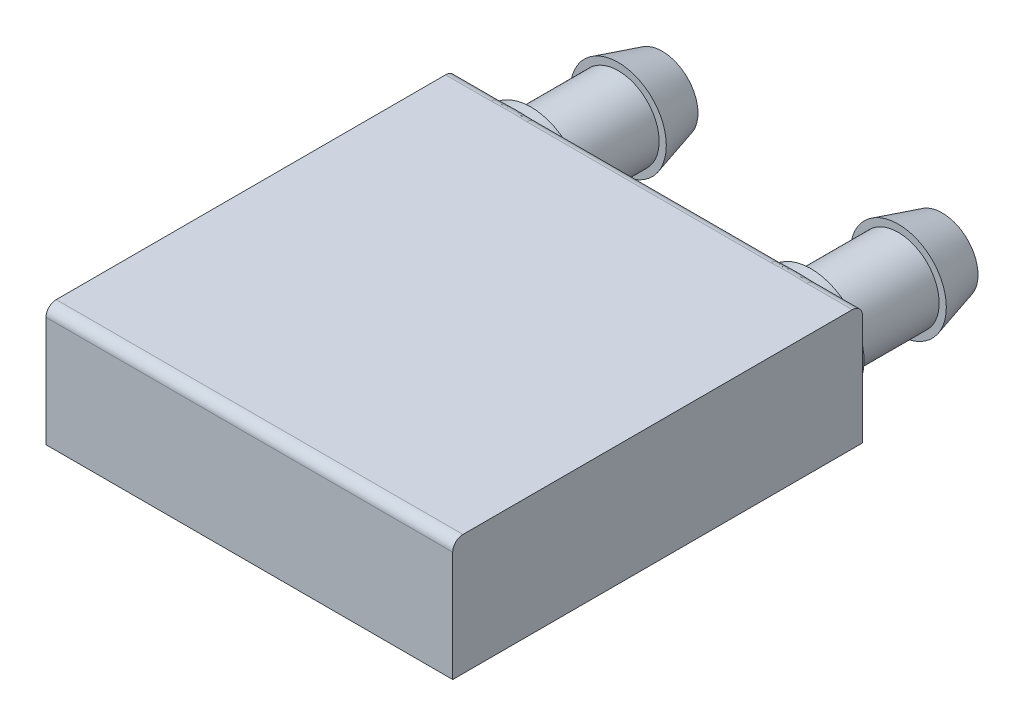
ISO-10303-21;
HEADER;
FILE_DESCRIPTION(('STEP AP214'),'2;1');
FILE_NAME('part.step','',(''),(''),'','','');
FILE_SCHEMA(('AUTOMOTIVE_DESIGN { 1 0 10303 214 1 1 1 1 }'));
ENDSEC;
DATA;
#1=APPLICATION_CONTEXT('core data for automotive mechanical design processes');
#2=APPLICATION_PROTOCOL_DEFINITION('international standard','automotive_design',2000,#1);
#3=PRODUCT_CONTEXT('',#1,'mechanical');
#4=PRODUCT('Part','Part','',(#3));
#5=PRODUCT_RELATED_PRODUCT_CATEGORY('part','',(#4));
#6=PRODUCT_DEFINITION_FORMATION('','',#4);
#7=PRODUCT_DEFINITION_CONTEXT('part definition',#1,'design');
#8=PRODUCT_DEFINITION('design','',#6,#7);
#9=PRODUCT_DEFINITION_SHAPE('','',#8);
#10=(LENGTH_UNIT() NAMED_UNIT(*) SI_UNIT(.MILLI.,.METRE.));
#11=(NAMED_UNIT(*) PLANE_ANGLE_UNIT() SI_UNIT($,.RADIAN.));
#12=(NAMED_UNIT(*) SI_UNIT($,.STERADIAN.) SOLID_ANGLE_UNIT());
#13=UNCERTAINTY_MEASURE_WITH_UNIT(LENGTH_MEASURE(1.E-05),#10,'distance_accuracy_value','');
#14=(GEOMETRIC_REPRESENTATION_CONTEXT(3) GLOBAL_UNCERTAINTY_ASSIGNED_CONTEXT((#13)) GLOBAL_UNIT_ASSIGNED_CONTEXT((#10,
#11,#12)) REPRESENTATION_CONTEXT('',''));
#15=CARTESIAN_POINT('',(0.,0.,0.));
#16=DIRECTION('',(0.,0.,1.));
#17=DIRECTION('',(1.,0.,0.));
#18=AXIS2_PLACEMENT_3D('',#15,#16,#17);
#19=CARTESIAN_POINT('',(0.,11.8,0.));
#20=DIRECTION('',(1.,0.,0.));
#21=DIRECTION('',(0.,0.,-1.));
#22=AXIS2_PLACEMENT_3D('',#19,#20,#21);
#23=PLANE('',#22);
#24=DIRECTION('',(0.,-1.,0.));
#25=VECTOR('',#24,1.);
#26=CARTESIAN_POINT('',(0.,11.8,0.));
#27=LINE('',#26,#25);
#28=CARTESIAN_POINT('',(0.,10.8,0.));
#29=VERTEX_POINT('',#28);
#30=CARTESIAN_POINT('',(0.,0.,0.));
#31=VERTEX_POINT('',#30);
#32=EDGE_CURVE('E117',#29,#31,#27,.T.);
#33=ORIENTED_EDGE('',*,*,#32,.F.);
#34=CARTESIAN_POINT('',(0.,10.8,-1.));
#35=DIRECTION('',(1.,0.,0.));
#36=DIRECTION('',(0.,0.,-1.));
#37=AXIS2_PLACEMENT_3D('',#34,#35,#36);
#38=CIRCLE('',#37,1.);
#39=CARTESIAN_POINT('',(0.,11.8,-1.));
#40=VERTEX_POINT('',#39);
#41=EDGE_CURVE('E397',#29,#40,#38,.F.);
#42=ORIENTED_EDGE('',*,*,#41,.T.);
#43=DIRECTION('',(0.,0.,1.));
#44=VECTOR('',#43,1.);
#45=CARTESIAN_POINT('',(0.,11.8,0.));
#46=LINE('',#45,#44);
#47=CARTESIAN_POINT('',(0.,11.8,-39.1));
#48=VERTEX_POINT('',#47);
#49=EDGE_CURVE('E152',#48,#40,#46,.T.);
#50=ORIENTED_EDGE('',*,*,#49,.F.);
#51=CARTESIAN_POINT('',(0.,10.8,-39.1));
#52=DIRECTION('',(1.,0.,0.));
#53=DIRECTION('',(0.,0.,-1.));
#54=AXIS2_PLACEMENT_3D('',#51,#52,#53);
#55=CIRCLE('',#54,1.);
#56=CARTESIAN_POINT('',(0.,10.8,-40.1));
#57=VERTEX_POINT('',#56);
#58=EDGE_CURVE('E395',#48,#57,#55,.F.);
#59=ORIENTED_EDGE('',*,*,#58,.T.);
#60=DIRECTION('',(0.,-1.,0.));
#61=VECTOR('',#60,1.);
#62=CARTESIAN_POINT('',(0.,11.8,-40.1));
#63=LINE('',#62,#61);
#64=CARTESIAN_POINT('',(0.,0.,-40.1));
#65=VERTEX_POINT('',#64);
#66=EDGE_CURVE('E138',#57,#65,#63,.T.);
#67=ORIENTED_EDGE('',*,*,#66,.T.);
#68=DIRECTION('',(0.,0.,1.));
#69=VECTOR('',#68,1.);
#70=CARTESIAN_POINT('',(0.,0.,0.));
#71=LINE('',#70,#69);
#72=EDGE_CURVE('E134',#65,#31,#71,.T.);
#73=ORIENTED_EDGE('',*,*,#72,.T.);
#74=EDGE_LOOP('',(#33,#42,#50,#59,#67,#73));
#75=FACE_BOUND('',#74,.T.);
#76=ADVANCED_FACE('F36',(#75),#23,.F.);
#77=CARTESIAN_POINT('',(0.,11.8,0.));
#78=DIRECTION('',(0.,0.,-1.));
#79=DIRECTION('',(-1.,0.,0.));
#80=AXIS2_PLACEMENT_3D('',#77,#78,#79);
#81=PLANE('',#80);
#82=DIRECTION('',(0.,-1.,0.));
#83=VECTOR('',#82,1.);
#84=CARTESIAN_POINT('',(39.8,11.8,0.));
#85=LINE('',#84,#83);
#86=CARTESIAN_POINT('',(39.8,10.8,0.));
#87=VERTEX_POINT('',#86);
#88=CARTESIAN_POINT('',(39.8,0.,0.));
#89=VERTEX_POINT('',#88);
#90=EDGE_CURVE('E128',#87,#89,#85,.T.);
#91=ORIENTED_EDGE('',*,*,#90,.F.);
#92=DIRECTION('',(1.,0.,0.));
#93=VECTOR('',#92,1.);
#94=CARTESIAN_POINT('',(0.,10.8,0.));
#95=LINE('',#94,#93);
#96=EDGE_CURVE('E124',#87,#29,#95,.F.);
#97=ORIENTED_EDGE('',*,*,#96,.T.);
#98=ORIENTED_EDGE('',*,*,#32,.T.);
#99=DIRECTION('',(1.,0.,0.));
#100=VECTOR('',#99,1.);
#101=CARTESIAN_POINT('',(0.,0.,0.));
#102=LINE('',#101,#100);
#103=EDGE_CURVE('E121',#31,#89,#102,.T.);
#104=ORIENTED_EDGE('',*,*,#103,.T.);
#105=EDGE_LOOP('',(#91,#97,#98,#104));
#106=FACE_BOUND('',#105,.T.);
#107=ADVANCED_FACE('F120',(#106),#81,.F.);
#108=CARTESIAN_POINT('',(39.8,11.8,0.));
#109=DIRECTION('',(-1.,0.,0.));
#110=DIRECTION('',(0.,0.,1.));
#111=AXIS2_PLACEMENT_3D('',#108,#109,#110);
#112=PLANE('',#111);
#113=DIRECTION('',(0.,0.,-1.));
#114=VECTOR('',#113,1.);
#115=CARTESIAN_POINT('',(39.8,11.8,0.));
#116=LINE('',#115,#114);
#117=CARTESIAN_POINT('',(39.8,11.8,-1.));
#118=VERTEX_POINT('',#117);
#119=CARTESIAN_POINT('',(39.8,11.8,-39.1));
#120=VERTEX_POINT('',#119);
#121=EDGE_CURVE('E146',#118,#120,#116,.T.);
#122=ORIENTED_EDGE('',*,*,#121,.F.);
#123=CARTESIAN_POINT('',(39.8,10.8,-1.));
#124=DIRECTION('',(-1.,0.,0.));
#125=DIRECTION('',(0.,0.,1.));
#126=AXIS2_PLACEMENT_3D('',#123,#124,#125);
#127=CIRCLE('',#126,1.);
#128=EDGE_CURVE('E263',#118,#87,#127,.F.);
#129=ORIENTED_EDGE('',*,*,#128,.T.);
#130=ORIENTED_EDGE('',*,*,#90,.T.);
#131=DIRECTION('',(0.,0.,-1.));
#132=VECTOR('',#131,1.);
#133=CARTESIAN_POINT('',(39.8,0.,0.));
#134=LINE('',#133,#132);
#135=CARTESIAN_POINT('',(39.8,0.,-40.1));
#136=VERTEX_POINT('',#135);
#137=EDGE_CURVE('E136',#89,#136,#134,.T.);
#138=ORIENTED_EDGE('',*,*,#137,.T.);
#139=DIRECTION('',(0.,-1.,0.));
#140=VECTOR('',#139,1.);
#141=CARTESIAN_POINT('',(39.8,11.8,-40.1));
#142=LINE('',#141,#140);
#143=CARTESIAN_POINT('',(39.8,10.8,-40.1));
#144=VERTEX_POINT('',#143);
#145=EDGE_CURVE('E154',#144,#136,#142,.T.);
#146=ORIENTED_EDGE('',*,*,#145,.F.);
#147=CARTESIAN_POINT('',(39.8,10.8,-39.1));
#148=DIRECTION('',(-1.,0.,0.));
#149=DIRECTION('',(0.,0.,1.));
#150=AXIS2_PLACEMENT_3D('',#147,#148,#149);
#151=CIRCLE('',#150,1.);
#152=EDGE_CURVE('E266',#144,#120,#151,.F.);
#153=ORIENTED_EDGE('',*,*,#152,.T.);
#154=EDGE_LOOP('',(#122,#129,#130,#138,#146,#153));
#155=FACE_BOUND('',#154,.T.);
#156=ADVANCED_FACE('F253',(#155),#112,.F.);
#157=CARTESIAN_POINT('',(0.,11.8,-40.1));
#158=DIRECTION('',(0.,0.,1.));
#159=DIRECTION('',(1.,0.,0.));
#160=AXIS2_PLACEMENT_3D('',#157,#158,#159);
#161=PLANE('',#160);
#162=ORIENTED_EDGE('',*,*,#66,.F.);
#163=DIRECTION('',(-1.,0.,0.));
#164=VECTOR('',#163,1.);
#165=CARTESIAN_POINT('',(0.,10.8,-40.1));
#166=LINE('',#165,#164);
#167=CARTESIAN_POINT('',(4.45931048144708,10.8,-40.1));
#168=VERTEX_POINT('',#167);
#169=EDGE_CURVE('E11',#57,#168,#166,.F.);
#170=ORIENTED_EDGE('',*,*,#169,.T.);
#171=CARTESIAN_POINT('',(6.2,5.9,-40.1));
#172=DIRECTION('',(0.,0.,1.));
#173=DIRECTION('',(1.,0.,0.));
#174=AXIS2_PLACEMENT_3D('',#171,#172,#173);
#175=CIRCLE('',#174,5.2);
#176=CARTESIAN_POINT('',(7.94068951855292,10.8,-40.1));
#177=VERTEX_POINT('',#176);
#178=EDGE_CURVE('E57',#177,#168,#175,.F.);
#179=ORIENTED_EDGE('',*,*,#178,.F.);
#180=DIRECTION('',(-1.,0.,0.));
#181=VECTOR('',#180,1.);
#182=CARTESIAN_POINT('',(0.,10.8,-40.1));
#183=LINE('',#182,#181);
#184=CARTESIAN_POINT('',(31.8593104814471,10.8,-40.1));
#185=VERTEX_POINT('',#184);
#186=EDGE_CURVE('E50',#177,#185,#183,.F.);
#187=ORIENTED_EDGE('',*,*,#186,.T.);
#188=CARTESIAN_POINT('',(33.6,5.9,-40.1));
#189=DIRECTION('',(0.,0.,1.));
#190=DIRECTION('',(1.,0.,0.));
#191=AXIS2_PLACEMENT_3D('',#188,#189,#190);
#192=CIRCLE('',#191,5.2);
#193=CARTESIAN_POINT('',(35.3406895185529,10.8,-40.1));
#194=VERTEX_POINT('',#193);
#195=EDGE_CURVE('E159',#194,#185,#192,.F.);
#196=ORIENTED_EDGE('',*,*,#195,.F.);
#197=DIRECTION('',(-1.,0.,0.));
#198=VECTOR('',#197,1.);
#199=CARTESIAN_POINT('',(0.,10.8,-40.1));
#200=LINE('',#199,#198);
#201=EDGE_CURVE('E385',#194,#144,#200,.F.);
#202=ORIENTED_EDGE('',*,*,#201,.T.);
#203=ORIENTED_EDGE('',*,*,#145,.T.);
#204=DIRECTION('',(-1.,0.,0.));
#205=VECTOR('',#204,1.);
#206=CARTESIAN_POINT('',(0.,0.,-40.1));
#207=LINE('',#206,#205);
#208=EDGE_CURVE('E150',#136,#65,#207,.T.);
#209=ORIENTED_EDGE('',*,*,#208,.T.);
#210=EDGE_LOOP('',(#162,#170,#179,#187,#196,#202,#203,#209));
#211=FACE_BOUND('',#210,.T.);
#212=ADVANCED_FACE('F200',(#211),#161,.F.);
#213=CARTESIAN_POINT('',(0.,11.8,0.));
#214=DIRECTION('',(0.,-1.,0.));
#215=DIRECTION('',(0.,0.,-1.));
#216=AXIS2_PLACEMENT_3D('',#213,#214,#215);
#217=PLANE('',#216);
#218=ORIENTED_EDGE('',*,*,#49,.T.);
#219=DIRECTION('',(1.,0.,0.));
#220=VECTOR('',#219,1.);
#221=CARTESIAN_POINT('',(0.,11.8,-1.));
#222=LINE('',#221,#220);
#223=EDGE_CURVE('E388',#40,#118,#222,.T.);
#224=ORIENTED_EDGE('',*,*,#223,.T.);
#225=ORIENTED_EDGE('',*,*,#121,.T.);
#226=DIRECTION('',(-1.,0.,0.));
#227=VECTOR('',#226,1.);
#228=CARTESIAN_POINT('',(0.,11.8,-39.1));
#229=LINE('',#228,#227);
#230=CARTESIAN_POINT('',(35.3406895185529,11.8,-39.1));
#231=VERTEX_POINT('',#230);
#232=EDGE_CURVE('E387',#120,#231,#229,.T.);
#233=ORIENTED_EDGE('',*,*,#232,.T.);
#234=CARTESIAN_POINT('',(36.2059590471005,10.3998863813251,-40.1));
#235=CARTESIAN_POINT('',(36.0514109053202,11.8,-40.6914062854075));
#236=CARTESIAN_POINT('',(36.4376715437162,11.8,-39.2133104201227));
#237=CARTESIAN_POINT('',(36.1642060523448,10.4240692555008,-40.1));
#238=CARTESIAN_POINT('',(36.0381126387893,11.8,-40.643262855771));
#239=CARTESIAN_POINT('',(36.3769460344585,11.8,-39.1974631160973));
#240=CARTESIAN_POINT('',(36.1210697849913,10.4482708656346,-40.1));
#241=CARTESIAN_POINT('',(36.0172464388454,11.8,-40.5966849735014));
#242=CARTESIAN_POINT('',(36.3157021977009,11.8,-39.1838071876804));
#243=CARTESIAN_POINT('',(36.0322298425646,10.4963900256952,-40.1));
#244=CARTESIAN_POINT('',(35.9640056764479,11.8,-40.509396550161));
#245=CARTESIAN_POINT('',(36.1925685955645,11.8,-39.1602493571056));
#246=CARTESIAN_POINT('',(35.9865294262411,10.5203078913845,-40.1));
#247=CARTESIAN_POINT('',(35.9319855313383,11.8,-40.4683833963861));
#248=CARTESIAN_POINT('',(36.1306797279427,11.8,-39.1503428086598));
#249=CARTESIAN_POINT('',(35.8461812900325,10.591012558989,-40.1));
#250=CARTESIAN_POINT('',(35.8253538891049,11.8,-40.3563215478172));
#251=CARTESIAN_POINT('',(35.9450130966358,11.8,-39.1253391762767));
#252=CARTESIAN_POINT('',(35.7478729462154,10.6369940358075,-40.1));
#253=CARTESIAN_POINT('',(35.7376385958731,11.8,-40.2907331487825));
#254=CARTESIAN_POINT('',(35.8206316990899,11.8,-39.1148150330412));
#255=CARTESIAN_POINT('',(35.5429722003345,10.7246473615643,-40.1));
#256=CARTESIAN_POINT('',(35.5442199881479,11.8,-40.1803396016544));
#257=CARTESIAN_POINT('',(35.5721926045747,11.8,-39.1020597674157));
#258=CARTESIAN_POINT('',(35.4364247568824,10.7663400568421,-40.1));
#259=CARTESIAN_POINT('',(35.438741025402,11.8,-40.1340441665053));
#260=CARTESIAN_POINT('',(35.4481365074836,11.8,-39.0997864895949));
#261=CARTESIAN_POINT('',(35.2152897020463,10.8441475617902,-40.1));
#262=CARTESIAN_POINT('',(35.2172403242021,11.8,-40.057013655889));
#263=CARTESIAN_POINT('',(35.1998879943171,11.8,-39.1002444128891));
#264=CARTESIAN_POINT('',(35.1006909366875,10.8802544022891,-40.1));
#265=CARTESIAN_POINT('',(35.1007482628657,11.8,-40.0254225232962));
#266=CARTESIAN_POINT('',(35.0756956334742,11.8,-39.1029826937221));
#267=CARTESIAN_POINT('',(34.8468065814125,10.9502787004041,-40.1));
#268=CARTESIAN_POINT('',(34.8442738684641,11.8,-39.9702131403183));
#269=CARTESIAN_POINT('',(34.8086467176646,11.8,-39.1113455617933));
#270=CARTESIAN_POINT('',(34.7064068986992,10.9830414301867,-40.1));
#271=CARTESIAN_POINT('',(34.7017278137248,11.8,-39.9476384193187));
#272=CARTESIAN_POINT('',(34.6658048157509,11.8,-39.117343680815));
#273=CARTESIAN_POINT('',(34.4187388570437,11.0372234313041,-40.1));
#274=CARTESIAN_POINT('',(34.4129045813957,11.8,-39.9134878291294));
#275=CARTESIAN_POINT('',(34.3801775211719,11.8,-39.1289136041271));
#276=CARTESIAN_POINT('',(34.2714742281667,11.0586487863993,-40.1));
#277=CARTESIAN_POINT('',(34.2652889772802,11.8,-39.9014966991213));
#278=CARTESIAN_POINT('',(34.2373921393676,11.8,-39.1344856356847));
#279=CARTESIAN_POINT('',(33.9728087517789,11.0887892077042,-40.1));
#280=CARTESIAN_POINT('',(33.9688748898342,11.8,-39.8853881779618));
#281=CARTESIAN_POINT('',(33.9516423633497,11.8,-39.1426885125737));
#282=CARTESIAN_POINT('',(33.8214055905964,11.0974970096581,-40.1));
#283=CARTESIAN_POINT('',(33.8185943817021,11.8,-39.8811016243287));
#284=CARTESIAN_POINT('',(33.8086779134743,11.8,-39.1453176767416));
#285=CARTESIAN_POINT('',(33.5180136011448,11.1015684432358,-40.1));
#286=CARTESIAN_POINT('',(33.519207924178,11.8,-39.8790842405912));
#287=CARTESIAN_POINT('',(33.5227096697332,11.8,-39.1465271735554));
#288=CARTESIAN_POINT('',(33.366024703579,11.0969304443387,-40.1));
#289=CARTESIAN_POINT('',(33.3685659606177,11.8,-39.8813335991971));
#290=CARTESIAN_POINT('',(33.3797058731946,11.8,-39.1451070114759));
#291=CARTESIAN_POINT('',(33.017327656511,11.0710654484401,-40.1));
#292=CARTESIAN_POINT('',(33.0229158871134,11.8,-39.8946918658663));
#293=CARTESIAN_POINT('',(33.0483990297321,11.8,-39.1377579045133));
#294=CARTESIAN_POINT('',(32.8217452995204,11.0450382663129,-40.1));
#295=CARTESIAN_POINT('',(32.8265939731261,11.8,-39.9086192322347));
#296=CARTESIAN_POINT('',(32.8601315408975,11.8,-39.1305403926206));
#297=CARTESIAN_POINT('',(32.4428328247797,10.9732855743908,-40.1));
#298=CARTESIAN_POINT('',(32.446044170586,11.8,-39.9540226263979));
#299=CARTESIAN_POINT('',(32.4836800417843,11.8,-39.1153032072669));
#300=CARTESIAN_POINT('',(32.259499230018,10.9275656823724,-40.1));
#301=CARTESIAN_POINT('',(32.2587343840027,11.8,-39.9864439667343));
#302=CARTESIAN_POINT('',(32.2954960230085,11.8,-39.1072837630752));
#303=CARTESIAN_POINT('',(31.9978414581151,10.8478629392358,-40.1));
#304=CARTESIAN_POINT('',(31.9973468152238,11.8,-40.054017069443));
#305=CARTESIAN_POINT('',(32.0138442298186,11.8,-39.1009052409067));
#306=CARTESIAN_POINT('',(31.9131792217457,10.8195855292717,-40.1));
#307=CARTESIAN_POINT('',(31.9117733639662,11.8,-40.0803585410739));
#308=CARTESIAN_POINT('',(31.9204614781234,11.8,-39.0997140696696));
#309=CARTESIAN_POINT('',(31.7484279791752,10.7599735819643,-40.1));
#310=CARTESIAN_POINT('',(31.7474358486076,11.8,-40.1412083903224));
#311=CARTESIAN_POINT('',(31.7337498998095,11.8,-39.1004040660646));
#312=CARTESIAN_POINT('',(31.6683365179222,10.7286407107396,-40.1));
#313=CARTESIAN_POINT('',(31.6684985952818,11.8,-40.1761069638797));
#314=CARTESIAN_POINT('',(31.640421071409,11.8,-39.1022835679949));
#315=CARTESIAN_POINT('',(31.5127128083606,10.6634412084335,-40.1));
#316=CARTESIAN_POINT('',(31.5199557858521,11.8,-40.2559067723442));
#317=CARTESIAN_POINT('',(31.4535134250338,11.8,-39.1104617477959));
#318=CARTESIAN_POINT('',(31.4372017570069,10.6295642134737,-40.1));
#319=CARTESIAN_POINT('',(31.4504114050832,11.8,-40.3014127733855));
#320=CARTESIAN_POINT('',(31.3599352695281,11.8,-39.1167794868437));
#321=CARTESIAN_POINT('',(31.2913540802878,10.5601209394779,-40.1));
#322=CARTESIAN_POINT('',(31.325857421665,11.8,-40.4035353078189));
#323=CARTESIAN_POINT('',(31.17322533657,11.8,-39.1355392468181));
#324=CARTESIAN_POINT('',(31.2210280655949,10.5245514287968,-40.1));
#325=CARTESIAN_POINT('',(31.2712349902899,11.8,-40.4609379374578));
#326=CARTESIAN_POINT('',(31.080094820163,11.8,-39.1479934462363));
#327=CARTESIAN_POINT('',(31.1535648380049,10.4885678591641,-40.1));
#328=CARTESIAN_POINT('',(31.22866427251,11.8,-40.5231845779229));
#329=CARTESIAN_POINT('',(30.9875220631558,11.8,-39.1643505899244));
#330=(BOUNDED_SURFACE() B_SPLINE_SURFACE(3,2,((#234,#235,#236),(#237,#238,#239),(#240,#241,
#242),(#243,#244,#245),(#246,#247,#248),(#249,#250,#251),(#252,#253,#254),(#255,#256,#257),
(#258,#259,#260),(#261,#262,#263),(#264,#265,#266),(#267,#268,#269),(#270,#271,#272),(#273,#274,
#275),(#276,#277,#278),(#279,#280,#281),(#282,#283,#284),(#285,#286,#287),(#288,#289,#290),
(#291,#292,#293),(#294,#295,#296),(#297,#298,#299),(#300,#301,#302),(#303,#304,#305),(#306,#307,
#308),(#309,#310,#311),(#312,#313,#314),(#315,#316,#317),(#318,#319,#320),(#321,#322,#323),
(#324,#325,#326),(#327,#328,#329)),.UNSPECIFIED.,.F.,.F.,.F.) B_SPLINE_SURFACE_WITH_KNOTS((4,2,
2,2,2,2,2,2,2,2,2,2,2,2,2,4),(3,3),(0.,0.188160562337904,0.376087183816642,0.750089334170194,
1.12217791638126,1.49479254567852,1.92369642323125,2.35236991223194,2.78128816353902,
3.21025882008098,3.77545021918975,4.34048049175736,4.62061503468712,4.90059766769383,
5.18179016989224,5.46354299157041),(0.,1.),
.UNSPECIFIED.) GEOMETRIC_REPRESENTATION_ITEM() RATIONAL_B_SPLINE_SURFACE(((1.,0.547670695457186,
1.),(1.,0.55870942729237,1.),(1.,0.569423565921806,1.),(1.,0.590171575439976,1.),(1.,
0.600206275546622,1.),(1.,0.629189184863191,1.),(1.,0.647125115902453,1.),(1.,0.680143283484577,
1.),(1.,0.695239651319312,1.),(1.,0.722676995885094,1.),(1.,0.735014046957487,1.),(1.,
0.758483860579576,1.),(1.,0.769153155051393,1.),(1.,0.786566890947717,1.),(1.,0.793313437554485,
1.),(1.,0.802756108122454,1.),(1.,0.805449917189763,1.),(1.,0.806711815618423,1.),(1.,
0.8052794008591,1.),(1.,0.797218225270102,1.),(1.,0.789083795491052,1.),(1.,0.766012291983896,
1.),(1.,0.751077158236021,1.),(1.,0.723885981241762,1.),(1.,0.714076078628515,1.),(1.,
0.692891977464697,1.),(1.,0.681518630077224,1.),(1.,0.657168011607321,1.),(1.,0.644184021977412,
1.),(1.,0.61664314601021,1.),(1.,0.602083176988512,1.),(1.,0.586757129979744,1.))) REPRESENTATION_ITEM('') SURFACE());
#331=CARTESIAN_POINT('',(36.4376715437162,11.8,-39.2133104201227));
#332=CARTESIAN_POINT('',(36.3769460344585,11.8,-39.1974631160973));
#333=CARTESIAN_POINT('',(36.3157021977009,11.8,-39.1838071876804));
#334=CARTESIAN_POINT('',(36.1925685955645,11.8,-39.1602493571056));
#335=CARTESIAN_POINT('',(36.1306797279427,11.8,-39.1503428086598));
#336=CARTESIAN_POINT('',(35.9450130966358,11.8,-39.1253391762767));
#337=CARTESIAN_POINT('',(35.8206316990898,11.8,-39.1148150330412));
#338=CARTESIAN_POINT('',(35.5721926045747,11.8,-39.1020597674157));
#339=CARTESIAN_POINT('',(35.4481365074836,11.8,-39.0997864895949));
#340=CARTESIAN_POINT('',(35.1998879943171,11.8,-39.1002444128891));
#341=CARTESIAN_POINT('',(35.0756956334742,11.8,-39.1029826937221));
#342=CARTESIAN_POINT('',(34.8086467176646,11.8,-39.1113455617933));
#343=CARTESIAN_POINT('',(34.6658048157509,11.8,-39.117343680815));
#344=CARTESIAN_POINT('',(34.3801775211719,11.8,-39.1289136041271));
#345=CARTESIAN_POINT('',(34.2373921393676,11.8,-39.1344856356847));
#346=CARTESIAN_POINT('',(33.9516423633497,11.8,-39.1426885125737));
#347=CARTESIAN_POINT('',(33.8086779134743,11.8,-39.1453176767416));
#348=CARTESIAN_POINT('',(33.5227096697332,11.8,-39.1465271735554));
#349=CARTESIAN_POINT('',(33.3797058731946,11.8,-39.1451070114758));
#350=CARTESIAN_POINT('',(33.0483990297321,11.8,-39.1377579045133));
#351=CARTESIAN_POINT('',(32.8601315408975,11.8,-39.1305403926206));
#352=CARTESIAN_POINT('',(32.4836800417843,11.8,-39.1153032072669));
#353=CARTESIAN_POINT('',(32.2954960230085,11.8,-39.1072837630752));
#354=CARTESIAN_POINT('',(32.0138442298186,11.8,-39.1009052409067));
#355=CARTESIAN_POINT('',(31.9204614781234,11.8,-39.0997140696695));
#356=CARTESIAN_POINT('',(31.7337498998095,11.8,-39.1004040660646));
#357=CARTESIAN_POINT('',(31.640421071409,11.8,-39.1022835679949));
#358=CARTESIAN_POINT('',(31.4535134250338,11.8,-39.1104617477959));
#359=CARTESIAN_POINT('',(31.3599352695281,11.8,-39.1167794868437));
#360=CARTESIAN_POINT('',(31.17322533657,11.8,-39.1355392468181));
#361=CARTESIAN_POINT('',(31.080094820163,11.8,-39.1479934462363));
#362=CARTESIAN_POINT('',(30.9875220631558,11.8,-39.1643505899244));
#363=B_SPLINE_CURVE_WITH_KNOTS('',3,(#331,#332,#333,#334,#335,#336,#337,#338,#339,#340,#341,
#342,#343,#344,#345,#346,#347,#348,#349,#350,#351,#352,#353,#354,#355,#356,#357,#358,#359,#360,
#361,#362),.UNSPECIFIED.,.F.,.F.,(4,2,2,2,2,2,2,2,2,2,2,2,2,2,2,4),(0.,0.188160562337904,
0.376087183816642,0.750089334170194,1.12217791638126,1.49479254567852,1.92369642323125,
2.35236991223194,2.78128816353902,3.21025882008098,3.77545021918975,4.34048049175736,
4.62061503468712,4.90059766769383,5.18179016989224,5.46354299157041),.UNSPECIFIED.);
#364=CARTESIAN_POINT('',(31.8593104814471,11.8,-39.1));
#365=VERTEX_POINT('',#364);
#366=EDGE_CURVE('E406',#231,#365,#363,.T.);
#367=ORIENTED_EDGE('',*,*,#366,.T.);
#368=DIRECTION('',(-1.,0.,0.));
#369=VECTOR('',#368,1.);
#370=CARTESIAN_POINT('',(0.,11.8,-39.1));
#371=LINE('',#370,#369);
#372=CARTESIAN_POINT('',(7.94068951855292,11.8,-39.1));
#373=VERTEX_POINT('',#372);
#374=EDGE_CURVE('E175',#365,#373,#371,.T.);
#375=ORIENTED_EDGE('',*,*,#374,.T.);
#376=CARTESIAN_POINT('',(8.80595906966206,10.3998863682593,-40.1));
#377=CARTESIAN_POINT('',(8.65141093451701,11.8,-40.6914063176011));
#378=CARTESIAN_POINT('',(9.0376715437162,11.8,-39.2133104201227));
#379=CARTESIAN_POINT('',(8.7642060606564,10.4240692506874,-40.1));
#380=CARTESIAN_POINT('',(8.63811264927779,11.8,-40.6432628672062));
#381=CARTESIAN_POINT('',(8.97694603446269,11.8,-39.1974631160981));
#382=CARTESIAN_POINT('',(8.72106978727092,10.4482708643145,-40.1));
#383=CARTESIAN_POINT('',(8.6172464416421,11.8,-40.5966849765277));
#384=CARTESIAN_POINT('',(8.91570219770932,11.8,-39.1838071876819));
#385=CARTESIAN_POINT('',(8.63222984030575,10.496390027004,-40.1));
#386=CARTESIAN_POINT('',(8.56400567381693,11.8,-40.5093965473498));
#387=CARTESIAN_POINT('',(8.79256859558231,11.8,-39.1602493571085));
#388=CARTESIAN_POINT('',(8.58652942546641,10.520307891834,-40.1));
#389=CARTESIAN_POINT('',(8.53198553045712,11.8,-40.468383395448));
#390=CARTESIAN_POINT('',(8.73067972796566,11.8,-39.1503428086633));
#391=CARTESIAN_POINT('',(8.44618129163544,10.5910125580634,-40.1));
#392=CARTESIAN_POINT('',(8.42535389075237,11.8,-40.3563215495721));
#393=CARTESIAN_POINT('',(8.5450130966726,11.8,-39.1253391762808));
#394=CARTESIAN_POINT('',(8.34787294667272,10.636994035547,-40.1));
#395=CARTESIAN_POINT('',(8.33763859631253,11.8,-40.2907331492449));
#396=CARTESIAN_POINT('',(8.42063169913544,11.8,-39.1148150330448));
#397=CARTESIAN_POINT('',(8.14297219995413,10.7246473617916,-40.1));
#398=CARTESIAN_POINT('',(8.14421998783213,11.8,-40.1803396012739));
#399=CARTESIAN_POINT('',(8.17219260462,11.8,-39.1020597674168));
#400=CARTESIAN_POINT('',(8.03642475680136,10.7663400568957,-40.1));
#401=CARTESIAN_POINT('',(8.03874102534524,11.8,-40.1340441664148));
#402=CARTESIAN_POINT('',(8.04813650751989,11.8,-39.0997864895952));
#403=CARTESIAN_POINT('',(7.81528970217602,10.8441475617195,-40.1));
#404=CARTESIAN_POINT('',(7.81724032429575,11.8,-40.0570136559897));
#405=CARTESIAN_POINT('',(7.79988799433525,11.8,-39.1002444128887));
#406=CARTESIAN_POINT('',(7.70069093672816,10.8802544022681,-40.1));
#407=CARTESIAN_POINT('',(7.70074826289462,11.8,-40.0254225233247));
#408=CARTESIAN_POINT('',(7.67569563348326,11.8,-39.1029826937218));
#409=CARTESIAN_POINT('',(7.44680658137538,10.9502787004256,-40.1));
#410=CARTESIAN_POINT('',(7.44427386844509,11.8,-39.9702131402894));
#411=CARTESIAN_POINT('',(7.40864671766462,11.8,-39.1113455617933));
#412=CARTESIAN_POINT('',(7.30640689868977,10.9830414301924,-40.1));
#413=CARTESIAN_POINT('',(7.30172781372068,11.8,-39.9476384193112));
#414=CARTESIAN_POINT('',(7.26580481575084,11.8,-39.117343680815));
#415=CARTESIAN_POINT('',(7.01873885705423,11.0372234312982,-40.1));
#416=CARTESIAN_POINT('',(7.01290458139972,11.8,-39.9134878291368));
#417=CARTESIAN_POINT('',(6.98017752117187,11.8,-39.1289136041272));
#418=CARTESIAN_POINT('',(6.87147422816968,11.0586487863977,-40.1));
#419=CARTESIAN_POINT('',(6.86528897728117,11.8,-39.9014966991232));
#420=CARTESIAN_POINT('',(6.83739213936757,11.8,-39.1344856356847));
#421=CARTESIAN_POINT('',(6.57280875177619,11.0887892077058,-40.1));
#422=CARTESIAN_POINT('',(6.56887488983361,11.8,-39.8853881779599));
#423=CARTESIAN_POINT('',(6.55164236334967,11.8,-39.1426885125737));
#424=CARTESIAN_POINT('',(6.42140559059565,11.0974970096586,-40.1));
#425=CARTESIAN_POINT('',(6.418594381702,11.8,-39.8811016243282));
#426=CARTESIAN_POINT('',(6.40867791347427,11.8,-39.1453176767416));
#427=CARTESIAN_POINT('',(6.1180136011455,11.1015684432353,-40.1));
#428=CARTESIAN_POINT('',(6.11920792417805,11.8,-39.8790842405917));
#429=CARTESIAN_POINT('',(6.12270966973315,11.8,-39.1465271735554));
#430=CARTESIAN_POINT('',(5.96602470357921,11.0969304443385,-40.1));
#431=CARTESIAN_POINT('',(5.96856596061771,11.8,-39.8813335991972));
#432=CARTESIAN_POINT('',(5.97970587319456,11.8,-39.1451070114759));
#433=CARTESIAN_POINT('',(5.61732765651071,11.0710654484402,-40.1));
#434=CARTESIAN_POINT('',(5.62291588711351,11.8,-39.8946918658661));
#435=CARTESIAN_POINT('',(5.64839902973213,11.8,-39.1377579045133));
#436=CARTESIAN_POINT('',(5.42174529952047,11.0450382663129,-40.1));
#437=CARTESIAN_POINT('',(5.42659397312623,11.8,-39.9086192322347));
#438=CARTESIAN_POINT('',(5.46013154089748,11.8,-39.1305403926206));
#439=CARTESIAN_POINT('',(5.04283282477971,10.9732855743908,-40.1));
#440=CARTESIAN_POINT('',(5.04604417058593,11.8,-39.9540226263979));
#441=CARTESIAN_POINT('',(5.08368004178434,11.8,-39.1153032072669));
#442=CARTESIAN_POINT('',(4.85949923001776,10.9275656823723,-40.1));
#443=CARTESIAN_POINT('',(4.8587343840025,11.8,-39.9864439667343));
#444=CARTESIAN_POINT('',(4.89549602300846,11.8,-39.1072837630752));
#445=CARTESIAN_POINT('',(4.59784145811496,10.8478629392358,-40.1));
#446=CARTESIAN_POINT('',(4.59734681522365,11.8,-40.054017069443));
#447=CARTESIAN_POINT('',(4.61384422981861,11.8,-39.1009052409067));
#448=CARTESIAN_POINT('',(4.51317922174569,10.8195855292717,-40.1));
#449=CARTESIAN_POINT('',(4.51177336396614,11.8,-40.0803585410739));
#450=CARTESIAN_POINT('',(4.52046147812334,11.8,-39.0997140696696));
#451=CARTESIAN_POINT('',(4.34842797917534,10.7599735819644,-40.1));
#452=CARTESIAN_POINT('',(4.34743584860777,11.8,-40.1412083903224));
#453=CARTESIAN_POINT('',(4.33374989980949,11.8,-39.1004040660646));
#454=CARTESIAN_POINT('',(4.2683365179224,10.7286407107397,-40.1));
#455=CARTESIAN_POINT('',(4.26849859528199,11.8,-40.1761069638796));
#456=CARTESIAN_POINT('',(4.24042107140902,11.8,-39.102283567995));
#457=CARTESIAN_POINT('',(4.11271280836083,10.6634412084336,-40.1));
#458=CARTESIAN_POINT('',(4.11995578585235,11.8,-40.255906772344));
#459=CARTESIAN_POINT('',(4.05351342503376,11.8,-39.1104617477959));
#460=CARTESIAN_POINT('',(4.03720175700708,10.6295642134738,-40.1));
#461=CARTESIAN_POINT('',(4.05041140508346,11.8,-40.3014127733853));
#462=CARTESIAN_POINT('',(3.95993526952808,11.8,-39.1167794868437));
#463=CARTESIAN_POINT('',(3.89135408028781,10.5601209394778,-40.1));
#464=CARTESIAN_POINT('',(3.92585742166498,11.8,-40.4035353078189));
#465=CARTESIAN_POINT('',(3.77322533657002,11.8,-39.1355392468181));
#466=CARTESIAN_POINT('',(3.82102806559466,10.5245514287966,-40.1));
#467=CARTESIAN_POINT('',(3.87123499028958,11.8,-40.4609379374579));
#468=CARTESIAN_POINT('',(3.68009482016295,11.8,-39.1479934462363));
#469=CARTESIAN_POINT('',(3.75356483800436,10.4885678591638,-40.1));
#470=CARTESIAN_POINT('',(3.82866427250931,11.8,-40.5231845779235));
#471=CARTESIAN_POINT('',(3.58752206315573,11.8,-39.1643505899244));
#472=(BOUNDED_SURFACE() B_SPLINE_SURFACE(3,2,((#376,#377,#378),(#379,#380,#381),(#382,#383,
#384),(#385,#386,#387),(#388,#389,#390),(#391,#392,#393),(#394,#395,#396),(#397,#398,#399),
(#400,#401,#402),(#403,#404,#405),(#406,#407,#408),(#409,#410,#411),(#412,#413,#414),(#415,#416,
#417),(#418,#419,#420),(#421,#422,#423),(#424,#425,#426),(#427,#428,#429),(#430,#431,#432),
(#433,#434,#435),(#436,#437,#438),(#439,#440,#441),(#442,#443,#444),(#445,#446,#447),(#448,#449,
#450),(#451,#452,#453),(#454,#455,#456),(#457,#458,#459),(#460,#461,#462),(#463,#464,#465),
(#466,#467,#468),(#469,#470,#471)),.UNSPECIFIED.,.F.,.F.,.F.) B_SPLINE_SURFACE_WITH_KNOTS((4,2,
2,2,2,2,2,2,2,2,2,2,2,2,2,4),(3,3),(0.,0.188160562325025,0.376087183788249,0.75008933411585,
1.12217791635404,1.49479254567855,1.92369642323129,2.35236991223196,2.78128816353904,
3.21025882008101,3.77545021918978,4.3404804917574,4.62061503468715,4.90059766769387,
5.18179016989228,5.46354299157045),(0.,1.),
.UNSPECIFIED.) GEOMETRIC_REPRESENTATION_ITEM() RATIONAL_B_SPLINE_SURFACE(((1.,0.547670689492929,
1.),(1.,0.5587094250952,1.),(1.,0.569423565319314,1.),(1.,0.590171576037615,1.),(1.,
0.600206275752195,1.),(1.,0.629189184441402,1.),(1.,0.647125115784685,1.),(1.,0.680143283589719,
1.),(1.,0.695239651344927,1.),(1.,0.722676995853412,1.),(1.,0.73501404694818,1.),(1.,
0.758483860589393,1.),(1.,0.769153155053994,1.),(1.,0.786566890945051,1.),(1.,0.793313437553765,
1.),(1.,0.802756108123165,1.),(1.,0.805449917189955,1.),(1.,0.806711815618231,1.),(1.,
0.80527940085904,1.),(1.,0.79721822527018,1.),(1.,0.789083795491082,1.),(1.,0.766012291983872,
1.),(1.,0.751077158235992,1.),(1.,0.723885981241749,1.),(1.,0.71407607862851,1.),(1.,
0.692891977464714,1.),(1.,0.681518630077253,1.),(1.,0.657168011607361,1.),(1.,0.644184021977453,
1.),(1.,0.616643146010207,1.),(1.,0.602083176988465,1.),(1.,0.586757129979617,1.))) REPRESENTATION_ITEM('') SURFACE());
#473=CARTESIAN_POINT('',(9.0376715437162,11.8,-39.2133104201227));
#474=CARTESIAN_POINT('',(8.97694603446269,11.8,-39.1974631160981));
#475=CARTESIAN_POINT('',(8.91570219770932,11.8,-39.1838071876819));
#476=CARTESIAN_POINT('',(8.79256859558231,11.8,-39.1602493571085));
#477=CARTESIAN_POINT('',(8.73067972796566,11.8,-39.1503428086633));
#478=CARTESIAN_POINT('',(8.5450130966726,11.8,-39.1253391762808));
#479=CARTESIAN_POINT('',(8.42063169913544,11.8,-39.1148150330448));
#480=CARTESIAN_POINT('',(8.17219260462,11.8,-39.1020597674168));
#481=CARTESIAN_POINT('',(8.04813650751989,11.8,-39.0997864895952));
#482=CARTESIAN_POINT('',(7.79988799433525,11.8,-39.1002444128887));
#483=CARTESIAN_POINT('',(7.67569563348326,11.8,-39.1029826937218));
#484=CARTESIAN_POINT('',(7.40864671766462,11.8,-39.1113455617933));
#485=CARTESIAN_POINT('',(7.26580481575084,11.8,-39.117343680815));
#486=CARTESIAN_POINT('',(6.98017752117187,11.8,-39.1289136041271));
#487=CARTESIAN_POINT('',(6.83739213936757,11.8,-39.1344856356847));
#488=CARTESIAN_POINT('',(6.55164236334967,11.8,-39.1426885125737));
#489=CARTESIAN_POINT('',(6.40867791347427,11.8,-39.1453176767416));
#490=CARTESIAN_POINT('',(6.12270966973315,11.8,-39.1465271735554));
#491=CARTESIAN_POINT('',(5.97970587319456,11.8,-39.1451070114758));
#492=CARTESIAN_POINT('',(5.64839902973213,11.8,-39.1377579045133));
#493=CARTESIAN_POINT('',(5.46013154089748,11.8,-39.1305403926206));
#494=CARTESIAN_POINT('',(5.08368004178433,11.8,-39.1153032072669));
#495=CARTESIAN_POINT('',(4.89549602300846,11.8,-39.1072837630752));
#496=CARTESIAN_POINT('',(4.61384422981861,11.8,-39.1009052409067));
#497=CARTESIAN_POINT('',(4.52046147812334,11.8,-39.0997140696695));
#498=CARTESIAN_POINT('',(4.33374989980949,11.8,-39.1004040660646));
#499=CARTESIAN_POINT('',(4.24042107140902,11.8,-39.102283567995));
#500=CARTESIAN_POINT('',(4.05351342503376,11.8,-39.110461747796));
#501=CARTESIAN_POINT('',(3.95993526952808,11.8,-39.1167794868437));
#502=CARTESIAN_POINT('',(3.77322533657001,11.8,-39.1355392468181));
#503=CARTESIAN_POINT('',(3.68009482016295,11.8,-39.1479934462363));
#504=CARTESIAN_POINT('',(3.58752206315573,11.8,-39.1643505899244));
#505=B_SPLINE_CURVE_WITH_KNOTS('',3,(#473,#474,#475,#476,#477,#478,#479,#480,#481,#482,#483,
#484,#485,#486,#487,#488,#489,#490,#491,#492,#493,#494,#495,#496,#497,#498,#499,#500,#501,#502,
#503,#504),.UNSPECIFIED.,.F.,.F.,(4,2,2,2,2,2,2,2,2,2,2,2,2,2,2,4),(0.,0.188160562325025,
0.376087183788249,0.75008933411585,1.12217791635404,1.49479254567855,1.92369642323129,
2.35236991223196,2.78128816353904,3.21025882008101,3.77545021918978,4.3404804917574,
4.62061503468715,4.90059766769387,5.18179016989228,5.46354299157045),.UNSPECIFIED.);
#506=CARTESIAN_POINT('',(4.45931048144708,11.8,-39.1));
#507=VERTEX_POINT('',#506);
#508=EDGE_CURVE('E166',#373,#507,#505,.T.);
#509=ORIENTED_EDGE('',*,*,#508,.T.);
#510=DIRECTION('',(-1.,0.,0.));
#511=VECTOR('',#510,1.);
#512=CARTESIAN_POINT('',(0.,11.8,-39.1));
#513=LINE('',#512,#511);
#514=EDGE_CURVE('E164',#507,#48,#513,.T.);
#515=ORIENTED_EDGE('',*,*,#514,.T.);
#516=EDGE_LOOP('',(#218,#224,#225,#233,#367,#375,#509,#515));
#517=FACE_BOUND('',#516,.T.);
#518=ADVANCED_FACE('F177',(#517),#217,.F.);
#519=CARTESIAN_POINT('',(0.,0.,0.));
#520=DIRECTION('',(0.,-1.,0.));
#521=DIRECTION('',(0.,0.,-1.));
#522=AXIS2_PLACEMENT_3D('',#519,#520,#521);
#523=PLANE('',#522);
#524=ORIENTED_EDGE('',*,*,#72,.F.);
#525=ORIENTED_EDGE('',*,*,#208,.F.);
#526=ORIENTED_EDGE('',*,*,#137,.F.);
#527=ORIENTED_EDGE('',*,*,#103,.F.);
#528=EDGE_LOOP('',(#524,#525,#526,#527));
#529=FACE_BOUND('',#528,.T.);
#530=ADVANCED_FACE('F132',(#529),#523,.T.);
#531=CARTESIAN_POINT('',(6.2,5.9,-41.25));
#532=DIRECTION('',(0.,0.,1.));
#533=DIRECTION('',(1.,0.,0.));
#534=AXIS2_PLACEMENT_3D('',#531,#532,#533);
#535=CYLINDRICAL_SURFACE('',#534,5.2);
#536=CARTESIAN_POINT('',(6.2,5.9,-41.25));
#537=DIRECTION('',(0.,0.,-1.));
#538=DIRECTION('',(-1.,0.,0.));
#539=AXIS2_PLACEMENT_3D('',#536,#537,#538);
#540=CIRCLE('',#539,5.2);
#541=CARTESIAN_POINT('',(1.,5.9,-41.25));
#542=VERTEX_POINT('',#541);
#543=EDGE_CURVE('E140',#542,#542,#540,.T.);
#544=ORIENTED_EDGE('',*,*,#543,.F.);
#545=EDGE_LOOP('',(#544));
#546=FACE_BOUND('',#545,.T.);
#547=EDGE_CURVE('E157',#168,#177,#175,.F.);
#548=ORIENTED_EDGE('',*,*,#547,.T.);
#549=ORIENTED_EDGE('',*,*,#178,.T.);
#550=EDGE_LOOP('',(#548,#549));
#551=FACE_BOUND('',#550,.T.);
#552=ADVANCED_FACE('F203',(#546,#551),#535,.T.);
#553=CARTESIAN_POINT('',(6.2,5.9,-41.25));
#554=DIRECTION('',(0.,0.,-1.));
#555=DIRECTION('',(-1.,0.,0.));
#556=AXIS2_PLACEMENT_3D('',#553,#554,#555);
#557=PLANE('',#556);
#558=CARTESIAN_POINT('',(6.2,5.9,-41.25));
#559=DIRECTION('',(0.,0.,-1.));
#560=DIRECTION('',(-1.,0.,0.));
#561=AXIS2_PLACEMENT_3D('',#558,#559,#560);
#562=CIRCLE('',#561,4.);
#563=CARTESIAN_POINT('',(2.2,5.9,-41.25));
#564=VERTEX_POINT('',#563);
#565=EDGE_CURVE('E167',#564,#564,#562,.T.);
#566=ORIENTED_EDGE('',*,*,#565,.F.);
#567=EDGE_LOOP('',(#566));
#568=FACE_BOUND('',#567,.T.);
#569=ORIENTED_EDGE('',*,*,#543,.T.);
#570=EDGE_LOOP('',(#569));
#571=FACE_BOUND('',#570,.T.);
#572=ADVANCED_FACE('F238',(#568,#571),#557,.T.);
#573=CARTESIAN_POINT('',(33.6,5.9,-41.25));
#574=DIRECTION('',(0.,0.,1.));
#575=DIRECTION('',(1.,0.,0.));
#576=AXIS2_PLACEMENT_3D('',#573,#574,#575);
#577=CYLINDRICAL_SURFACE('',#576,5.2);
#578=CARTESIAN_POINT('',(33.6,5.9,-41.25));
#579=DIRECTION('',(0.,0.,-1.));
#580=DIRECTION('',(-1.,0.,0.));
#581=AXIS2_PLACEMENT_3D('',#578,#579,#580);
#582=CIRCLE('',#581,5.2);
#583=CARTESIAN_POINT('',(28.4,5.9,-41.25));
#584=VERTEX_POINT('',#583);
#585=EDGE_CURVE('E143',#584,#584,#582,.T.);
#586=ORIENTED_EDGE('',*,*,#585,.F.);
#587=EDGE_LOOP('',(#586));
#588=FACE_BOUND('',#587,.T.);
#589=EDGE_CURVE('E160',#185,#194,#192,.F.);
#590=ORIENTED_EDGE('',*,*,#589,.T.);
#591=ORIENTED_EDGE('',*,*,#195,.T.);
#592=EDGE_LOOP('',(#590,#591));
#593=FACE_BOUND('',#592,.T.);
#594=ADVANCED_FACE('F233',(#588,#593),#577,.T.);
#595=CARTESIAN_POINT('',(33.6,5.9,-41.25));
#596=DIRECTION('',(0.,0.,-1.));
#597=DIRECTION('',(-1.,0.,0.));
#598=AXIS2_PLACEMENT_3D('',#595,#596,#597);
#599=PLANE('',#598);
#600=CARTESIAN_POINT('',(33.6,5.9,-41.25));
#601=DIRECTION('',(0.,0.,-1.));
#602=DIRECTION('',(-1.,0.,0.));
#603=AXIS2_PLACEMENT_3D('',#600,#601,#602);
#604=CIRCLE('',#603,4.);
#605=CARTESIAN_POINT('',(29.6,5.9,-41.25));
#606=VERTEX_POINT('',#605);
#607=EDGE_CURVE('E163',#606,#606,#604,.T.);
#608=ORIENTED_EDGE('',*,*,#607,.F.);
#609=EDGE_LOOP('',(#608));
#610=FACE_BOUND('',#609,.T.);
#611=ORIENTED_EDGE('',*,*,#585,.T.);
#612=EDGE_LOOP('',(#611));
#613=FACE_BOUND('',#612,.T.);
#614=ADVANCED_FACE('F237',(#610,#613),#599,.T.);
#615=CARTESIAN_POINT('',(33.6,5.9,-49.8));
#616=DIRECTION('',(0.,0.,1.));
#617=DIRECTION('',(1.,0.,0.));
#618=AXIS2_PLACEMENT_3D('',#615,#616,#617);
#619=CYLINDRICAL_SURFACE('',#618,4.);
#620=CARTESIAN_POINT('',(33.6,5.9,-49.8));
#621=DIRECTION('',(0.,0.,-1.));
#622=DIRECTION('',(-1.,0.,0.));
#623=AXIS2_PLACEMENT_3D('',#620,#621,#622);
#624=CIRCLE('',#623,4.);
#625=CARTESIAN_POINT('',(29.6,5.9,-49.8));
#626=VERTEX_POINT('',#625);
#627=EDGE_CURVE('E277',#626,#626,#624,.T.);
#628=ORIENTED_EDGE('',*,*,#627,.F.);
#629=EDGE_LOOP('',(#628));
#630=FACE_BOUND('',#629,.T.);
#631=ORIENTED_EDGE('',*,*,#607,.T.);
#632=EDGE_LOOP('',(#631));
#633=FACE_BOUND('',#632,.T.);
#634=ADVANCED_FACE('F342',(#630,#633),#619,.T.);
#635=CARTESIAN_POINT('',(6.2,5.9,-49.8));
#636=DIRECTION('',(0.,0.,1.));
#637=DIRECTION('',(1.,0.,0.));
#638=AXIS2_PLACEMENT_3D('',#635,#636,#637);
#639=CYLINDRICAL_SURFACE('',#638,4.);
#640=CARTESIAN_POINT('',(6.2,5.9,-49.8));
#641=DIRECTION('',(0.,0.,-1.));
#642=DIRECTION('',(-1.,0.,0.));
#643=AXIS2_PLACEMENT_3D('',#640,#641,#642);
#644=CIRCLE('',#643,4.);
#645=CARTESIAN_POINT('',(2.2,5.9,-49.8));
#646=VERTEX_POINT('',#645);
#647=EDGE_CURVE('E282',#646,#646,#644,.T.);
#648=ORIENTED_EDGE('',*,*,#647,.F.);
#649=EDGE_LOOP('',(#648));
#650=FACE_BOUND('',#649,.T.);
#651=ORIENTED_EDGE('',*,*,#565,.T.);
#652=EDGE_LOOP('',(#651));
#653=FACE_BOUND('',#652,.T.);
#654=ADVANCED_FACE('F336',(#650,#653),#639,.T.);
#655=CARTESIAN_POINT('',(6.2,5.9,-49.8));
#656=DIRECTION('',(0.,0.,1.));
#657=DIRECTION('',(1.,0.,0.));
#658=AXIS2_PLACEMENT_3D('',#655,#656,#657);
#659=PLANE('',#658);
#660=CARTESIAN_POINT('',(6.2,5.9,-49.8));
#661=DIRECTION('',(0.,0.,1.));
#662=DIRECTION('',(1.,0.,0.));
#663=AXIS2_PLACEMENT_3D('',#660,#661,#662);
#664=CIRCLE('',#663,4.7);
#665=CARTESIAN_POINT('',(10.9,5.9,-49.8));
#666=VERTEX_POINT('',#665);
#667=EDGE_CURVE('E287',#666,#666,#664,.T.);
#668=ORIENTED_EDGE('',*,*,#667,.T.);
#669=EDGE_LOOP('',(#668));
#670=FACE_BOUND('',#669,.T.);
#671=ORIENTED_EDGE('',*,*,#647,.T.);
#672=EDGE_LOOP('',(#671));
#673=FACE_BOUND('',#672,.T.);
#674=ADVANCED_FACE('F330',(#670,#673),#659,.T.);
#675=CARTESIAN_POINT('',(6.2,5.9,-49.8));
#676=DIRECTION('',(0.,0.,1.));
#677=DIRECTION('',(1.,0.,0.));
#678=AXIS2_PLACEMENT_3D('',#675,#676,#677);
#679=CONICAL_SURFACE('',#678,4.7,0.272145890531187);
#680=CARTESIAN_POINT('',(6.2,5.9,-54.1));
#681=DIRECTION('',(0.,0.,1.));
#682=DIRECTION('',(1.,0.,0.));
#683=AXIS2_PLACEMENT_3D('',#680,#681,#682);
#684=CIRCLE('',#683,3.5);
#685=CARTESIAN_POINT('',(9.7,5.9,-54.1));
#686=VERTEX_POINT('',#685);
#687=EDGE_CURVE('E290',#686,#686,#684,.T.);
#688=ORIENTED_EDGE('',*,*,#687,.T.);
#689=EDGE_LOOP('',(#688));
#690=FACE_BOUND('',#689,.T.);
#691=ORIENTED_EDGE('',*,*,#667,.F.);
#692=EDGE_LOOP('',(#691));
#693=FACE_BOUND('',#692,.T.);
#694=ADVANCED_FACE('F324',(#690,#693),#679,.T.);
#695=CARTESIAN_POINT('',(9.7,5.9,-54.1));
#696=DIRECTION('',(0.,0.,-1.));
#697=DIRECTION('',(-1.,0.,0.));
#698=AXIS2_PLACEMENT_3D('',#695,#696,#697);
#699=PLANE('',#698);
#700=CARTESIAN_POINT('',(6.2,5.9,-54.1));
#701=DIRECTION('',(0.,0.,-1.));
#702=DIRECTION('',(-1.,0.,0.));
#703=AXIS2_PLACEMENT_3D('',#700,#701,#702);
#704=CIRCLE('',#703,3.15);
#705=CARTESIAN_POINT('',(3.05,5.9,-54.1));
#706=VERTEX_POINT('',#705);
#707=EDGE_CURVE('E305',#706,#706,#704,.T.);
#708=ORIENTED_EDGE('',*,*,#707,.F.);
#709=EDGE_LOOP('',(#708));
#710=FACE_BOUND('',#709,.T.);
#711=ORIENTED_EDGE('',*,*,#687,.F.);
#712=EDGE_LOOP('',(#711));
#713=FACE_BOUND('',#712,.T.);
#714=ADVANCED_FACE('F320',(#710,#713),#699,.T.);
#715=CARTESIAN_POINT('',(33.6,5.9,-49.8));
#716=DIRECTION('',(0.,0.,-1.));
#717=DIRECTION('',(-1.,0.,0.));
#718=AXIS2_PLACEMENT_3D('',#715,#716,#717);
#719=PLANE('',#718);
#720=CARTESIAN_POINT('',(33.6,5.9,-49.8));
#721=DIRECTION('',(0.,0.,1.));
#722=DIRECTION('',(1.,0.,0.));
#723=AXIS2_PLACEMENT_3D('',#720,#721,#722);
#724=CIRCLE('',#723,4.7);
#725=CARTESIAN_POINT('',(38.3,5.9,-49.8));
#726=VERTEX_POINT('',#725);
#727=EDGE_CURVE('E296',#726,#726,#724,.T.);
#728=ORIENTED_EDGE('',*,*,#727,.T.);
#729=EDGE_LOOP('',(#728));
#730=FACE_BOUND('',#729,.T.);
#731=ORIENTED_EDGE('',*,*,#627,.T.);
#732=EDGE_LOOP('',(#731));
#733=FACE_BOUND('',#732,.T.);
#734=ADVANCED_FACE('F323',(#730,#733),#719,.F.);
#735=CARTESIAN_POINT('',(33.6,5.9,-54.1));
#736=DIRECTION('',(0.,0.,1.));
#737=DIRECTION('',(1.,0.,0.));
#738=AXIS2_PLACEMENT_3D('',#735,#736,#737);
#739=PLANE('',#738);
#740=CARTESIAN_POINT('',(33.6,5.9,-54.1));
#741=DIRECTION('',(0.,0.,-1.));
#742=DIRECTION('',(-1.,0.,0.));
#743=AXIS2_PLACEMENT_3D('',#740,#741,#742);
#744=CIRCLE('',#743,3.15);
#745=CARTESIAN_POINT('',(30.45,5.9,-54.1));
#746=VERTEX_POINT('',#745);
#747=EDGE_CURVE('E211',#746,#746,#744,.T.);
#748=ORIENTED_EDGE('',*,*,#747,.F.);
#749=EDGE_LOOP('',(#748));
#750=FACE_BOUND('',#749,.T.);
#751=CARTESIAN_POINT('',(33.6,5.9,-54.1));
#752=DIRECTION('',(0.,0.,1.));
#753=DIRECTION('',(1.,0.,0.));
#754=AXIS2_PLACEMENT_3D('',#751,#752,#753);
#755=CIRCLE('',#754,3.5);
#756=CARTESIAN_POINT('',(37.1,5.9,-54.1));
#757=VERTEX_POINT('',#756);
#758=EDGE_CURVE('E293',#757,#757,#755,.T.);
#759=ORIENTED_EDGE('',*,*,#758,.F.);
#760=EDGE_LOOP('',(#759));
#761=FACE_BOUND('',#760,.T.);
#762=ADVANCED_FACE('F349',(#750,#761),#739,.F.);
#763=CARTESIAN_POINT('',(33.6,5.9,-54.1));
#764=DIRECTION('',(0.,0.,1.));
#765=DIRECTION('',(1.,0.,0.));
#766=AXIS2_PLACEMENT_3D('',#763,#764,#765);
#767=CONICAL_SURFACE('',#766,3.5,0.272145890531187);
#768=ORIENTED_EDGE('',*,*,#727,.F.);
#769=EDGE_LOOP('',(#768));
#770=FACE_BOUND('',#769,.T.);
#771=ORIENTED_EDGE('',*,*,#758,.T.);
#772=EDGE_LOOP('',(#771));
#773=FACE_BOUND('',#772,.T.);
#774=ADVANCED_FACE('F352',(#770,#773),#767,.T.);
#775=CARTESIAN_POINT('',(33.6,5.9,-39.1));
#776=DIRECTION('',(0.,0.,-1.));
#777=DIRECTION('',(-1.,0.,0.));
#778=AXIS2_PLACEMENT_3D('',#775,#776,#777);
#779=CYLINDRICAL_SURFACE('',#778,3.15);
#780=CARTESIAN_POINT('',(33.6,5.9,-39.1));
#781=DIRECTION('',(0.,0.,-1.));
#782=DIRECTION('',(-1.,0.,0.));
#783=AXIS2_PLACEMENT_3D('',#780,#781,#782);
#784=CIRCLE('',#783,3.15);
#785=CARTESIAN_POINT('',(30.45,5.9,-39.1));
#786=VERTEX_POINT('',#785);
#787=EDGE_CURVE('E302',#786,#786,#784,.T.);
#788=ORIENTED_EDGE('',*,*,#787,.F.);
#789=EDGE_LOOP('',(#788));
#790=FACE_BOUND('',#789,.T.);
#791=ORIENTED_EDGE('',*,*,#747,.T.);
#792=EDGE_LOOP('',(#791));
#793=FACE_BOUND('',#792,.T.);
#794=ADVANCED_FACE('F356',(#790,#793),#779,.F.);
#795=CARTESIAN_POINT('',(33.6,5.9,-39.1));
#796=DIRECTION('',(0.,0.,-1.));
#797=DIRECTION('',(-1.,0.,0.));
#798=AXIS2_PLACEMENT_3D('',#795,#796,#797);
#799=PLANE('',#798);
#800=ORIENTED_EDGE('',*,*,#787,.T.);
#801=EDGE_LOOP('',(#800));
#802=FACE_BOUND('',#801,.T.);
#803=ADVANCED_FACE('F316',(#802),#799,.T.);
#804=CARTESIAN_POINT('',(6.2,5.9,-39.1));
#805=DIRECTION('',(0.,0.,-1.));
#806=DIRECTION('',(-1.,0.,0.));
#807=AXIS2_PLACEMENT_3D('',#804,#805,#806);
#808=CYLINDRICAL_SURFACE('',#807,3.15);
#809=CARTESIAN_POINT('',(6.2,5.9,-39.1));
#810=DIRECTION('',(0.,0.,-1.));
#811=DIRECTION('',(-1.,0.,0.));
#812=AXIS2_PLACEMENT_3D('',#809,#810,#811);
#813=CIRCLE('',#812,3.15);
#814=CARTESIAN_POINT('',(3.05,5.9,-39.1));
#815=VERTEX_POINT('',#814);
#816=EDGE_CURVE('E299',#815,#815,#813,.T.);
#817=ORIENTED_EDGE('',*,*,#816,.F.);
#818=EDGE_LOOP('',(#817));
#819=FACE_BOUND('',#818,.T.);
#820=ORIENTED_EDGE('',*,*,#707,.T.);
#821=EDGE_LOOP('',(#820));
#822=FACE_BOUND('',#821,.T.);
#823=ADVANCED_FACE('F313',(#819,#822),#808,.F.);
#824=CARTESIAN_POINT('',(6.2,5.9,-39.1));
#825=DIRECTION('',(0.,0.,-1.));
#826=DIRECTION('',(-1.,0.,0.));
#827=AXIS2_PLACEMENT_3D('',#824,#825,#826);
#828=PLANE('',#827);
#829=ORIENTED_EDGE('',*,*,#816,.T.);
#830=EDGE_LOOP('',(#829));
#831=FACE_BOUND('',#830,.T.);
#832=ADVANCED_FACE('F311',(#831),#828,.T.);
#833=CARTESIAN_POINT('',(0.,10.8,-1.));
#834=DIRECTION('',(1.,0.,0.));
#835=DIRECTION('',(0.,0.,-1.));
#836=AXIS2_PLACEMENT_3D('',#833,#834,#835);
#837=CYLINDRICAL_SURFACE('',#836,1.);
#838=ORIENTED_EDGE('',*,*,#41,.F.);
#839=ORIENTED_EDGE('',*,*,#96,.F.);
#840=ORIENTED_EDGE('',*,*,#128,.F.);
#841=ORIENTED_EDGE('',*,*,#223,.F.);
#842=EDGE_LOOP('',(#838,#839,#840,#841));
#843=FACE_BOUND('',#842,.T.);
#844=ADVANCED_FACE('F368',(#843),#837,.T.);
#845=CARTESIAN_POINT('',(0.,10.8,-39.1));
#846=DIRECTION('',(-1.,0.,0.));
#847=DIRECTION('',(0.,0.,1.));
#848=AXIS2_PLACEMENT_3D('',#845,#846,#847);
#849=CYLINDRICAL_SURFACE('',#848,1.);
#850=ORIENTED_EDGE('',*,*,#58,.F.);
#851=ORIENTED_EDGE('',*,*,#514,.F.);
#852=CARTESIAN_POINT('',(4.45931048144708,10.8,-39.1));
#853=DIRECTION('',(1.,0.,0.));
#854=DIRECTION('',(0.,0.,-1.));
#855=AXIS2_PLACEMENT_3D('',#852,#853,#854);
#856=CIRCLE('',#855,1.);
#857=EDGE_CURVE('E208',#168,#507,#856,.T.);
#858=ORIENTED_EDGE('',*,*,#857,.F.);
#859=ORIENTED_EDGE('',*,*,#169,.F.);
#860=EDGE_LOOP('',(#850,#851,#858,#859));
#861=FACE_BOUND('',#860,.T.);
#862=ADVANCED_FACE('F38',(#861),#849,.T.);
#863=ORIENTED_EDGE('',*,*,#857,.T.);
#864=ORIENTED_EDGE('',*,*,#508,.F.);
#865=CARTESIAN_POINT('',(7.94068951855292,10.8,-39.1));
#866=DIRECTION('',(1.,0.,0.));
#867=DIRECTION('',(0.,0.,-1.));
#868=AXIS2_PLACEMENT_3D('',#865,#866,#867);
#869=CIRCLE('',#868,1.);
#870=EDGE_CURVE('E212',#177,#373,#869,.T.);
#871=ORIENTED_EDGE('',*,*,#870,.F.);
#872=ORIENTED_EDGE('',*,*,#547,.F.);
#873=EDGE_LOOP('',(#863,#864,#871,#872));
#874=FACE_BOUND('',#873,.T.);
#875=ADVANCED_FACE('F189',(#874),#472,.T.);
#876=CARTESIAN_POINT('',(0.,10.8,-39.1));
#877=DIRECTION('',(-1.,0.,0.));
#878=DIRECTION('',(0.,0.,1.));
#879=AXIS2_PLACEMENT_3D('',#876,#877,#878);
#880=CYLINDRICAL_SURFACE('',#879,1.);
#881=ORIENTED_EDGE('',*,*,#870,.T.);
#882=ORIENTED_EDGE('',*,*,#374,.F.);
#883=CARTESIAN_POINT('',(31.8593104814471,10.8,-39.1));
#884=DIRECTION('',(1.,0.,0.));
#885=DIRECTION('',(0.,0.,-1.));
#886=AXIS2_PLACEMENT_3D('',#883,#884,#885);
#887=CIRCLE('',#886,1.);
#888=EDGE_CURVE('E215',#185,#365,#887,.T.);
#889=ORIENTED_EDGE('',*,*,#888,.F.);
#890=ORIENTED_EDGE('',*,*,#186,.F.);
#891=EDGE_LOOP('',(#881,#882,#889,#890));
#892=FACE_BOUND('',#891,.T.);
#893=ADVANCED_FACE('F194',(#892),#880,.T.);
#894=ORIENTED_EDGE('',*,*,#888,.T.);
#895=ORIENTED_EDGE('',*,*,#366,.F.);
#896=CARTESIAN_POINT('',(35.3406895185529,10.8,-39.1));
#897=DIRECTION('',(1.,0.,0.));
#898=DIRECTION('',(0.,0.,-1.));
#899=AXIS2_PLACEMENT_3D('',#896,#897,#898);
#900=CIRCLE('',#899,1.);
#901=EDGE_CURVE('E401',#194,#231,#900,.T.);
#902=ORIENTED_EDGE('',*,*,#901,.F.);
#903=ORIENTED_EDGE('',*,*,#589,.F.);
#904=EDGE_LOOP('',(#894,#895,#902,#903));
#905=FACE_BOUND('',#904,.T.);
#906=ADVANCED_FACE('F230',(#905),#330,.T.);
#907=CARTESIAN_POINT('',(0.,10.8,-39.1));
#908=DIRECTION('',(-1.,0.,0.));
#909=DIRECTION('',(0.,0.,1.));
#910=AXIS2_PLACEMENT_3D('',#907,#908,#909);
#911=CYLINDRICAL_SURFACE('',#910,1.);
#912=ORIENTED_EDGE('',*,*,#152,.F.);
#913=ORIENTED_EDGE('',*,*,#201,.F.);
#914=ORIENTED_EDGE('',*,*,#901,.T.);
#915=ORIENTED_EDGE('',*,*,#232,.F.);
#916=EDGE_LOOP('',(#912,#913,#914,#915));
#917=FACE_BOUND('',#916,.T.);
#918=ADVANCED_FACE('F377',(#917),#911,.T.);
#919=CLOSED_SHELL('',(#76,#107,#156,#212,#518,#530,#552,#572,#594,#614,#634,#654,#674,#694,#714,
#734,#762,#774,#794,#803,#823,#832,#844,#862,#875,#893,#906,#918));
#920=MANIFOLD_SOLID_BREP('B2',#919);
#921=ADVANCED_BREP_SHAPE_REPRESENTATION('',(#18,#920),#14);
#922=SHAPE_DEFINITION_REPRESENTATION(#9,#921);
ENDSEC;
END-ISO-10303-21;
